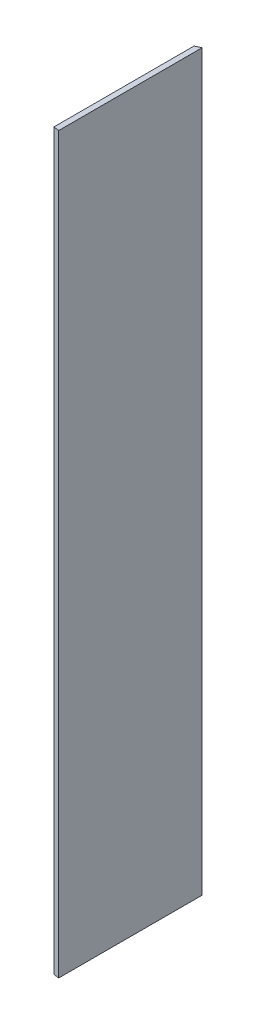
ISO-10303-21;
HEADER;
FILE_DESCRIPTION(('STEP AP214'),'2;1');
FILE_NAME('part.step','',(''),(''),'','','');
FILE_SCHEMA(('AUTOMOTIVE_DESIGN { 1 0 10303 214 1 1 1 1 }'));
ENDSEC;
DATA;
#1=APPLICATION_CONTEXT('core data for automotive mechanical design processes');
#2=APPLICATION_PROTOCOL_DEFINITION('international standard','automotive_design',2000,#1);
#3=PRODUCT_CONTEXT('',#1,'mechanical');
#4=PRODUCT('Part','Part','',(#3));
#5=PRODUCT_RELATED_PRODUCT_CATEGORY('part','',(#4));
#6=PRODUCT_DEFINITION_FORMATION('','',#4);
#7=PRODUCT_DEFINITION_CONTEXT('part definition',#1,'design');
#8=PRODUCT_DEFINITION('design','',#6,#7);
#9=PRODUCT_DEFINITION_SHAPE('','',#8);
#10=(LENGTH_UNIT() NAMED_UNIT(*) SI_UNIT(.MILLI.,.METRE.));
#11=(NAMED_UNIT(*) PLANE_ANGLE_UNIT() SI_UNIT($,.RADIAN.));
#12=(NAMED_UNIT(*) SI_UNIT($,.STERADIAN.) SOLID_ANGLE_UNIT());
#13=UNCERTAINTY_MEASURE_WITH_UNIT(LENGTH_MEASURE(1.E-05),#10,'distance_accuracy_value','');
#14=(GEOMETRIC_REPRESENTATION_CONTEXT(3) GLOBAL_UNCERTAINTY_ASSIGNED_CONTEXT((#13)) GLOBAL_UNIT_ASSIGNED_CONTEXT((#10,
#11,#12)) REPRESENTATION_CONTEXT('',''));
#15=CARTESIAN_POINT('',(0.,0.,0.));
#16=DIRECTION('',(0.,0.,1.));
#17=DIRECTION('',(1.,0.,0.));
#18=AXIS2_PLACEMENT_3D('',#15,#16,#17);
#19=CARTESIAN_POINT('',(5.02637904605247,533.,3.7635081833482));
#20=DIRECTION('',(0.408416038201876,0.,0.912795891609665));
#21=DIRECTION('',(0.912795891609665,0.,-0.408416038201876));
#22=AXIS2_PLACEMENT_3D('',#19,#20,#21);
#23=PLANE('',#22);
#24=DIRECTION('',(-0.912795891609665,0.,0.408416038201876));
#25=VECTOR('',#24,1.);
#26=CARTESIAN_POINT('',(5.02637904605247,0.,3.7635081833482));
#27=LINE('',#26,#25);
#28=CARTESIAN_POINT('',(5.02637904605247,0.,3.7635081833482));
#29=VERTEX_POINT('',#28);
#30=CARTESIAN_POINT('',(1.02637904605246,0.,5.55324471461876));
#31=VERTEX_POINT('',#30);
#32=EDGE_CURVE('E96',#29,#31,#27,.T.);
#33=ORIENTED_EDGE('',*,*,#32,.T.);
#34=DIRECTION('',(0.,-1.,0.));
#35=VECTOR('',#34,1.);
#36=CARTESIAN_POINT('',(1.02637904605246,533.,5.55324471461876));
#37=LINE('',#36,#35);
#38=CARTESIAN_POINT('',(1.02637904605246,533.,5.55324471461876));
#39=VERTEX_POINT('',#38);
#40=EDGE_CURVE('E11',#39,#31,#37,.T.);
#41=ORIENTED_EDGE('',*,*,#40,.F.);
#42=DIRECTION('',(-0.912795891609665,0.,0.408416038201876));
#43=VECTOR('',#42,1.);
#44=CARTESIAN_POINT('',(5.02637904605247,533.,3.7635081833482));
#45=LINE('',#44,#43);
#46=CARTESIAN_POINT('',(5.02637904605247,533.,3.7635081833482));
#47=VERTEX_POINT('',#46);
#48=EDGE_CURVE('E84',#47,#39,#45,.T.);
#49=ORIENTED_EDGE('',*,*,#48,.F.);
#50=DIRECTION('',(0.,-1.,0.));
#51=VECTOR('',#50,1.);
#52=CARTESIAN_POINT('',(5.02637904605247,533.,3.7635081833482));
#53=LINE('',#52,#51);
#54=EDGE_CURVE('E92',#47,#29,#53,.T.);
#55=ORIENTED_EDGE('',*,*,#54,.T.);
#56=EDGE_LOOP('',(#33,#41,#49,#55));
#57=FACE_BOUND('',#56,.T.);
#58=ADVANCED_FACE('F33',(#57),#23,.F.);
#59=CARTESIAN_POINT('',(1.02637904605246,533.,5.55324471461876));
#60=DIRECTION('',(1.,0.,0.));
#61=DIRECTION('',(0.,0.,-1.));
#62=AXIS2_PLACEMENT_3D('',#59,#60,#61);
#63=PLANE('',#62);
#64=DIRECTION('',(0.,0.,1.));
#65=VECTOR('',#64,1.);
#66=CARTESIAN_POINT('',(1.02637904605246,0.,5.55324471461876));
#67=LINE('',#66,#65);
#68=CARTESIAN_POINT('',(1.02637904605248,0.,107.324896907544));
#69=VERTEX_POINT('',#68);
#70=EDGE_CURVE('E88',#31,#69,#67,.T.);
#71=ORIENTED_EDGE('',*,*,#70,.T.);
#72=DIRECTION('',(0.,-1.,0.));
#73=VECTOR('',#72,1.);
#74=CARTESIAN_POINT('',(1.02637904605248,533.,107.324896907544));
#75=LINE('',#74,#73);
#76=CARTESIAN_POINT('',(1.02637904605248,533.,107.324896907544));
#77=VERTEX_POINT('',#76);
#78=EDGE_CURVE('E41',#77,#69,#75,.T.);
#79=ORIENTED_EDGE('',*,*,#78,.F.);
#80=DIRECTION('',(0.,0.,1.));
#81=VECTOR('',#80,1.);
#82=CARTESIAN_POINT('',(1.02637904605246,533.,5.55324471461876));
#83=LINE('',#82,#81);
#84=EDGE_CURVE('E79',#39,#77,#83,.T.);
#85=ORIENTED_EDGE('',*,*,#84,.F.);
#86=ORIENTED_EDGE('',*,*,#40,.T.);
#87=EDGE_LOOP('',(#71,#79,#85,#86));
#88=FACE_BOUND('',#87,.T.);
#89=ADVANCED_FACE('F87',(#88),#63,.F.);
#90=CARTESIAN_POINT('',(1.02637904605248,533.,107.324896907544));
#91=DIRECTION('',(0.12742836011959,0.,-0.991847777149917));
#92=DIRECTION('',(-0.991847777149917,0.,-0.12742836011959));
#93=AXIS2_PLACEMENT_3D('',#90,#91,#92);
#94=PLANE('',#93);
#95=DIRECTION('',(0.991847777149917,0.,0.12742836011959));
#96=VECTOR('',#95,1.);
#97=CARTESIAN_POINT('',(1.02637904605248,0.,107.324896907544));
#98=LINE('',#97,#96);
#99=CARTESIAN_POINT('',(5.02637904605247,0.,107.838799798916));
#100=VERTEX_POINT('',#99);
#101=EDGE_CURVE('E66',#69,#100,#98,.T.);
#102=ORIENTED_EDGE('',*,*,#101,.T.);
#103=DIRECTION('',(0.,-1.,0.));
#104=VECTOR('',#103,1.);
#105=CARTESIAN_POINT('',(5.02637904605247,533.,107.838799798916));
#106=LINE('',#105,#104);
#107=CARTESIAN_POINT('',(5.02637904605247,533.,107.838799798916));
#108=VERTEX_POINT('',#107);
#109=EDGE_CURVE('E89',#108,#100,#106,.T.);
#110=ORIENTED_EDGE('',*,*,#109,.F.);
#111=DIRECTION('',(0.991847777149917,0.,0.12742836011959));
#112=VECTOR('',#111,1.);
#113=CARTESIAN_POINT('',(1.02637904605248,533.,107.324896907544));
#114=LINE('',#113,#112);
#115=EDGE_CURVE('E82',#77,#108,#114,.T.);
#116=ORIENTED_EDGE('',*,*,#115,.F.);
#117=ORIENTED_EDGE('',*,*,#78,.T.);
#118=EDGE_LOOP('',(#102,#110,#116,#117));
#119=FACE_BOUND('',#118,.T.);
#120=ADVANCED_FACE('F90',(#119),#94,.F.);
#121=CARTESIAN_POINT('',(5.02637904605247,533.,107.838799798916));
#122=DIRECTION('',(-1.,0.,0.));
#123=DIRECTION('',(0.,0.,1.));
#124=AXIS2_PLACEMENT_3D('',#121,#122,#123);
#125=PLANE('',#124);
#126=DIRECTION('',(0.,0.,-1.));
#127=VECTOR('',#126,1.);
#128=CARTESIAN_POINT('',(5.02637904605247,0.,107.838799798916));
#129=LINE('',#128,#127);
#130=EDGE_CURVE('E72',#100,#29,#129,.T.);
#131=ORIENTED_EDGE('',*,*,#130,.T.);
#132=ORIENTED_EDGE('',*,*,#54,.F.);
#133=DIRECTION('',(0.,0.,-1.));
#134=VECTOR('',#133,1.);
#135=CARTESIAN_POINT('',(5.02637904605247,533.,107.838799798916));
#136=LINE('',#135,#134);
#137=EDGE_CURVE('E49',#108,#47,#136,.T.);
#138=ORIENTED_EDGE('',*,*,#137,.F.);
#139=ORIENTED_EDGE('',*,*,#109,.T.);
#140=EDGE_LOOP('',(#131,#132,#138,#139));
#141=FACE_BOUND('',#140,.T.);
#142=ADVANCED_FACE('F103',(#141),#125,.F.);
#143=CARTESIAN_POINT('',(1.02637904605246,533.,5.55324471461876));
#144=DIRECTION('',(0.,1.,0.));
#145=DIRECTION('',(0.,0.,1.));
#146=AXIS2_PLACEMENT_3D('',#143,#144,#145);
#147=PLANE('',#146);
#148=ORIENTED_EDGE('',*,*,#48,.T.);
#149=ORIENTED_EDGE('',*,*,#84,.T.);
#150=ORIENTED_EDGE('',*,*,#115,.T.);
#151=ORIENTED_EDGE('',*,*,#137,.T.);
#152=EDGE_LOOP('',(#148,#149,#150,#151));
#153=FACE_BOUND('',#152,.T.);
#154=ADVANCED_FACE('F80',(#153),#147,.T.);
#155=CARTESIAN_POINT('',(1.02637904605246,0.,5.55324471461876));
#156=DIRECTION('',(0.,1.,0.));
#157=DIRECTION('',(0.,0.,1.));
#158=AXIS2_PLACEMENT_3D('',#155,#156,#157);
#159=PLANE('',#158);
#160=ORIENTED_EDGE('',*,*,#32,.F.);
#161=ORIENTED_EDGE('',*,*,#130,.F.);
#162=ORIENTED_EDGE('',*,*,#101,.F.);
#163=ORIENTED_EDGE('',*,*,#70,.F.);
#164=EDGE_LOOP('',(#160,#161,#162,#163));
#165=FACE_BOUND('',#164,.T.);
#166=ADVANCED_FACE('F106',(#165),#159,.F.);
#167=CLOSED_SHELL('',(#58,#89,#120,#142,#154,#166));
#168=MANIFOLD_SOLID_BREP('B2',#167);
#169=ADVANCED_BREP_SHAPE_REPRESENTATION('',(#18,#168),#14);
#170=SHAPE_DEFINITION_REPRESENTATION(#9,#169);
ENDSEC;
END-ISO-10303-21;
